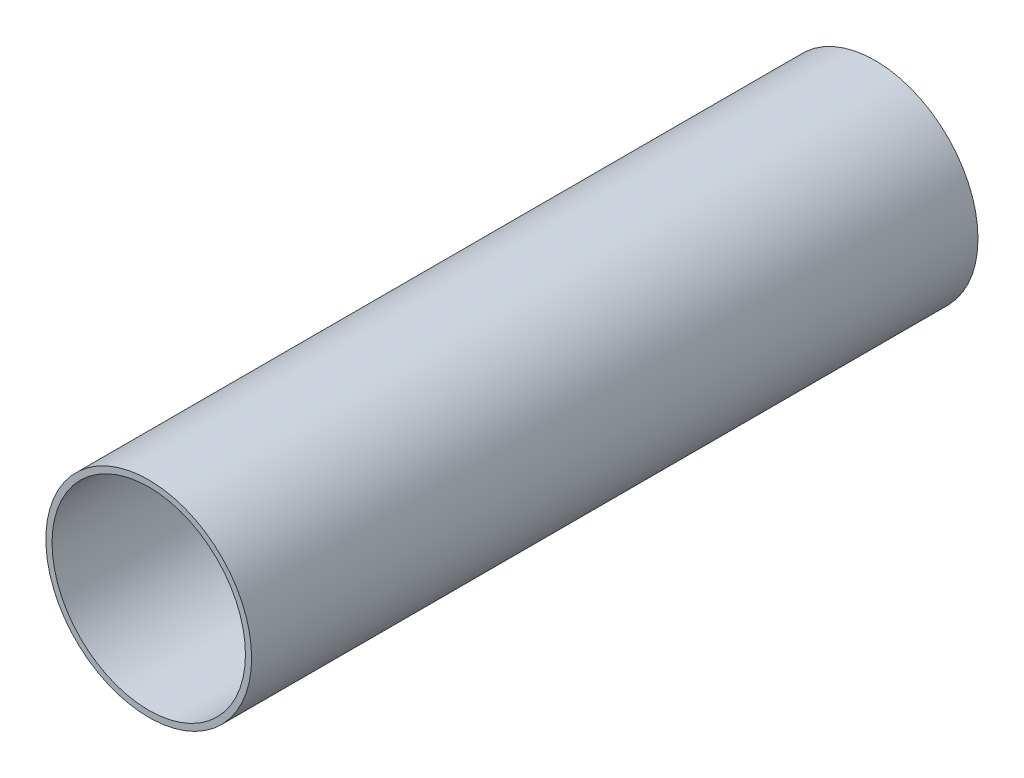
ISO-10303-21;
HEADER;
FILE_DESCRIPTION(('STEP AP214'),'2;1');
FILE_NAME('part.step','',(''),(''),'','','');
FILE_SCHEMA(('AUTOMOTIVE_DESIGN { 1 0 10303 214 1 1 1 1 }'));
ENDSEC;
DATA;
#1=APPLICATION_CONTEXT('core data for automotive mechanical design processes');
#2=APPLICATION_PROTOCOL_DEFINITION('international standard','automotive_design',2000,#1);
#3=PRODUCT_CONTEXT('',#1,'mechanical');
#4=PRODUCT('Part','Part','',(#3));
#5=PRODUCT_RELATED_PRODUCT_CATEGORY('part','',(#4));
#6=PRODUCT_DEFINITION_FORMATION('','',#4);
#7=PRODUCT_DEFINITION_CONTEXT('part definition',#1,'design');
#8=PRODUCT_DEFINITION('design','',#6,#7);
#9=PRODUCT_DEFINITION_SHAPE('','',#8);
#10=(LENGTH_UNIT() NAMED_UNIT(*) SI_UNIT(.MILLI.,.METRE.));
#11=(NAMED_UNIT(*) PLANE_ANGLE_UNIT() SI_UNIT($,.RADIAN.));
#12=(NAMED_UNIT(*) SI_UNIT($,.STERADIAN.) SOLID_ANGLE_UNIT());
#13=UNCERTAINTY_MEASURE_WITH_UNIT(LENGTH_MEASURE(1.E-05),#10,'distance_accuracy_value','');
#14=(GEOMETRIC_REPRESENTATION_CONTEXT(3) GLOBAL_UNCERTAINTY_ASSIGNED_CONTEXT((#13)) GLOBAL_UNIT_ASSIGNED_CONTEXT((#10,
#11,#12)) REPRESENTATION_CONTEXT('',''));
#15=CARTESIAN_POINT('',(0.,0.,0.));
#16=DIRECTION('',(0.,0.,1.));
#17=DIRECTION('',(1.,0.,0.));
#18=AXIS2_PLACEMENT_3D('',#15,#16,#17);
#19=CARTESIAN_POINT('',(0.,0.,3.));
#20=DIRECTION('',(0.,0.,-1.));
#21=DIRECTION('',(-1.,0.,0.));
#22=AXIS2_PLACEMENT_3D('',#19,#20,#21);
#23=CYLINDRICAL_SURFACE('',#22,50.);
#24=CARTESIAN_POINT('',(0.,0.,0.));
#25=DIRECTION('',(0.,0.,1.));
#26=DIRECTION('',(1.,0.,0.));
#27=AXIS2_PLACEMENT_3D('',#24,#25,#26);
#28=CIRCLE('',#27,50.);
#29=CARTESIAN_POINT('',(50.,0.,0.));
#30=VERTEX_POINT('',#29);
#31=EDGE_CURVE('E42',#30,#30,#28,.T.);
#32=ORIENTED_EDGE('',*,*,#31,.T.);
#33=EDGE_LOOP('',(#32));
#34=FACE_BOUND('',#33,.T.);
#35=CARTESIAN_POINT('',(0.,0.,353.));
#36=DIRECTION('',(0.,0.,1.));
#37=DIRECTION('',(1.,0.,0.));
#38=AXIS2_PLACEMENT_3D('',#35,#36,#37);
#39=CIRCLE('',#38,50.);
#40=CARTESIAN_POINT('',(50.,0.,353.));
#41=VERTEX_POINT('',#40);
#42=EDGE_CURVE('E46',#41,#41,#39,.T.);
#43=ORIENTED_EDGE('',*,*,#42,.F.);
#44=EDGE_LOOP('',(#43));
#45=FACE_BOUND('',#44,.T.);
#46=ADVANCED_FACE('F35',(#34,#45),#23,.T.);
#47=CARTESIAN_POINT('',(0.,0.,0.));
#48=DIRECTION('',(0.,0.,1.));
#49=DIRECTION('',(1.,0.,0.));
#50=AXIS2_PLACEMENT_3D('',#47,#48,#49);
#51=PLANE('',#50);
#52=CARTESIAN_POINT('',(0.,0.,0.));
#53=DIRECTION('',(0.,0.,-1.));
#54=DIRECTION('',(-1.,0.,0.));
#55=AXIS2_PLACEMENT_3D('',#52,#53,#54);
#56=CIRCLE('',#55,3.);
#57=CARTESIAN_POINT('',(-3.,0.,0.));
#58=VERTEX_POINT('',#57);
#59=EDGE_CURVE('E54',#58,#58,#56,.T.);
#60=ORIENTED_EDGE('',*,*,#59,.F.);
#61=EDGE_LOOP('',(#60));
#62=FACE_BOUND('',#61,.T.);
#63=ORIENTED_EDGE('',*,*,#31,.F.);
#64=EDGE_LOOP('',(#63));
#65=FACE_BOUND('',#64,.T.);
#66=ADVANCED_FACE('F78',(#62,#65),#51,.F.);
#67=CARTESIAN_POINT('',(0.,0.,353.));
#68=DIRECTION('',(0.,0.,1.));
#69=DIRECTION('',(1.,0.,0.));
#70=AXIS2_PLACEMENT_3D('',#67,#68,#69);
#71=PLANE('',#70);
#72=ORIENTED_EDGE('',*,*,#42,.T.);
#73=EDGE_LOOP('',(#72));
#74=FACE_BOUND('',#73,.T.);
#75=CARTESIAN_POINT('',(0.,0.,353.));
#76=DIRECTION('',(0.,0.,1.));
#77=DIRECTION('',(1.,0.,0.));
#78=AXIS2_PLACEMENT_3D('',#75,#76,#77);
#79=CIRCLE('',#78,47.);
#80=CARTESIAN_POINT('',(47.,0.,353.));
#81=VERTEX_POINT('',#80);
#82=EDGE_CURVE('E51',#81,#81,#79,.T.);
#83=ORIENTED_EDGE('',*,*,#82,.F.);
#84=EDGE_LOOP('',(#83));
#85=FACE_BOUND('',#84,.T.);
#86=ADVANCED_FACE('F73',(#74,#85),#71,.T.);
#87=CARTESIAN_POINT('',(0.,0.,353.));
#88=DIRECTION('',(0.,0.,-1.));
#89=DIRECTION('',(-1.,0.,0.));
#90=AXIS2_PLACEMENT_3D('',#87,#88,#89);
#91=CYLINDRICAL_SURFACE('',#90,47.);
#92=ORIENTED_EDGE('',*,*,#82,.T.);
#93=EDGE_LOOP('',(#92));
#94=FACE_BOUND('',#93,.T.);
#95=CARTESIAN_POINT('',(0.,0.,3.));
#96=DIRECTION('',(0.,0.,1.));
#97=DIRECTION('',(1.,0.,0.));
#98=AXIS2_PLACEMENT_3D('',#95,#96,#97);
#99=CIRCLE('',#98,47.);
#100=CARTESIAN_POINT('',(47.,0.,3.));
#101=VERTEX_POINT('',#100);
#102=EDGE_CURVE('E10',#101,#101,#99,.F.);
#103=ORIENTED_EDGE('',*,*,#102,.T.);
#104=EDGE_LOOP('',(#103));
#105=FACE_BOUND('',#104,.T.);
#106=ADVANCED_FACE('F66',(#94,#105),#91,.F.);
#107=CARTESIAN_POINT('',(0.,0.,3.));
#108=DIRECTION('',(0.,0.,1.));
#109=DIRECTION('',(1.,0.,0.));
#110=AXIS2_PLACEMENT_3D('',#107,#108,#109);
#111=PLANE('',#110);
#112=CARTESIAN_POINT('',(0.,0.,3.));
#113=DIRECTION('',(0.,0.,1.));
#114=DIRECTION('',(1.,0.,0.));
#115=AXIS2_PLACEMENT_3D('',#112,#113,#114);
#116=CIRCLE('',#115,3.);
#117=CARTESIAN_POINT('',(3.,0.,3.));
#118=VERTEX_POINT('',#117);
#119=EDGE_CURVE('E38',#118,#118,#116,.T.);
#120=ORIENTED_EDGE('',*,*,#119,.F.);
#121=EDGE_LOOP('',(#120));
#122=FACE_BOUND('',#121,.T.);
#123=ORIENTED_EDGE('',*,*,#102,.F.);
#124=EDGE_LOOP('',(#123));
#125=FACE_BOUND('',#124,.T.);
#126=ADVANCED_FACE('F63',(#122,#125),#111,.T.);
#127=CARTESIAN_POINT('',(0.,0.,350.));
#128=DIRECTION('',(0.,0.,-1.));
#129=DIRECTION('',(-1.,0.,0.));
#130=AXIS2_PLACEMENT_3D('',#127,#128,#129);
#131=CYLINDRICAL_SURFACE('',#130,3.);
#132=ORIENTED_EDGE('',*,*,#119,.T.);
#133=EDGE_LOOP('',(#132));
#134=FACE_BOUND('',#133,.T.);
#135=ORIENTED_EDGE('',*,*,#59,.T.);
#136=EDGE_LOOP('',(#135));
#137=FACE_BOUND('',#136,.T.);
#138=ADVANCED_FACE('F61',(#134,#137),#131,.F.);
#139=CLOSED_SHELL('',(#46,#66,#86,#106,#126,#138));
#140=MANIFOLD_SOLID_BREP('B2',#139);
#141=ADVANCED_BREP_SHAPE_REPRESENTATION('',(#18,#140),#14);
#142=SHAPE_DEFINITION_REPRESENTATION(#9,#141);
ENDSEC;
END-ISO-10303-21;
